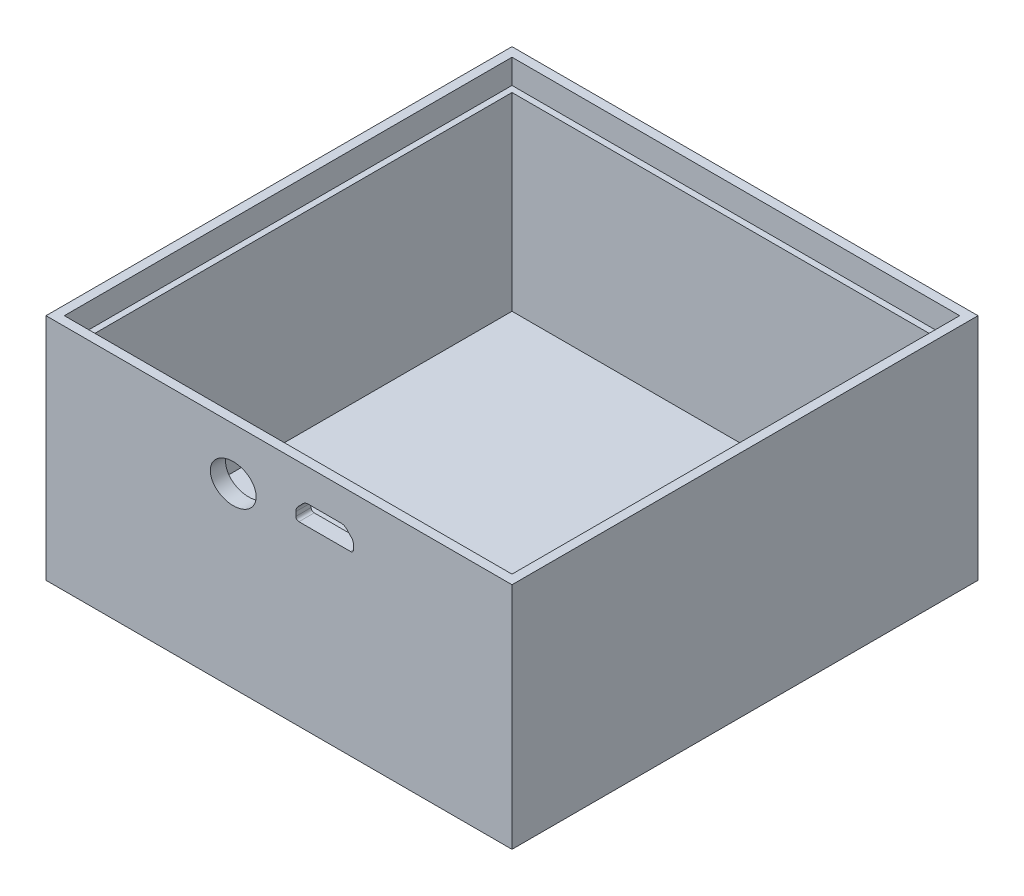
ISO-10303-21;
HEADER;
FILE_DESCRIPTION(('STEP AP214'),'2;1');
FILE_NAME('part.step','',(''),(''),'','','');
FILE_SCHEMA(('AUTOMOTIVE_DESIGN { 1 0 10303 214 1 1 1 1 }'));
ENDSEC;
DATA;
#1=APPLICATION_CONTEXT('core data for automotive mechanical design processes');
#2=APPLICATION_PROTOCOL_DEFINITION('international standard','automotive_design',2000,#1);
#3=PRODUCT_CONTEXT('',#1,'mechanical');
#4=PRODUCT('Part','Part','',(#3));
#5=PRODUCT_RELATED_PRODUCT_CATEGORY('part','',(#4));
#6=PRODUCT_DEFINITION_FORMATION('','',#4);
#7=PRODUCT_DEFINITION_CONTEXT('part definition',#1,'design');
#8=PRODUCT_DEFINITION('design','',#6,#7);
#9=PRODUCT_DEFINITION_SHAPE('','',#8);
#10=(LENGTH_UNIT() NAMED_UNIT(*) SI_UNIT(.MILLI.,.METRE.));
#11=(NAMED_UNIT(*) PLANE_ANGLE_UNIT() SI_UNIT($,.RADIAN.));
#12=(NAMED_UNIT(*) SI_UNIT($,.STERADIAN.) SOLID_ANGLE_UNIT());
#13=UNCERTAINTY_MEASURE_WITH_UNIT(LENGTH_MEASURE(1.E-05),#10,'distance_accuracy_value','');
#14=(GEOMETRIC_REPRESENTATION_CONTEXT(3) GLOBAL_UNCERTAINTY_ASSIGNED_CONTEXT((#13)) GLOBAL_UNIT_ASSIGNED_CONTEXT((#10,
#11,#12)) REPRESENTATION_CONTEXT('',''));
#15=CARTESIAN_POINT('',(0.,0.,0.));
#16=DIRECTION('',(0.,0.,1.));
#17=DIRECTION('',(1.,0.,0.));
#18=AXIS2_PLACEMENT_3D('',#15,#16,#17);
#19=CARTESIAN_POINT('',(-28.5,30.,0.));
#20=DIRECTION('',(0.,0.,-1.));
#21=DIRECTION('',(-1.,0.,0.));
#22=AXIS2_PLACEMENT_3D('',#19,#20,#21);
#23=PLANE('',#22);
#24=DIRECTION('',(-1.,0.,0.));
#25=VECTOR('',#24,1.);
#26=CARTESIAN_POINT('',(-28.5,2.,0.));
#27=LINE('',#26,#25);
#28=CARTESIAN_POINT('',(28.5,2.,0.));
#29=VERTEX_POINT('',#28);
#30=CARTESIAN_POINT('',(-28.5,2.,0.));
#31=VERTEX_POINT('',#30);
#32=EDGE_CURVE('E213',#29,#31,#27,.T.);
#33=ORIENTED_EDGE('',*,*,#32,.T.);
#34=DIRECTION('',(0.,-1.,0.));
#35=VECTOR('',#34,1.);
#36=CARTESIAN_POINT('',(-28.5,30.,0.));
#37=LINE('',#36,#35);
#38=CARTESIAN_POINT('',(-28.5,26.8,0.));
#39=VERTEX_POINT('',#38);
#40=EDGE_CURVE('E201',#39,#31,#37,.T.);
#41=ORIENTED_EDGE('',*,*,#40,.F.);
#42=DIRECTION('',(1.,0.,0.));
#43=VECTOR('',#42,1.);
#44=CARTESIAN_POINT('',(-28.5,26.8,0.));
#45=LINE('',#44,#43);
#46=CARTESIAN_POINT('',(28.5,26.8,0.));
#47=VERTEX_POINT('',#46);
#48=EDGE_CURVE('E210',#39,#47,#45,.T.);
#49=ORIENTED_EDGE('',*,*,#48,.T.);
#50=DIRECTION('',(0.,-1.,0.));
#51=VECTOR('',#50,1.);
#52=CARTESIAN_POINT('',(28.5,30.,0.));
#53=LINE('',#52,#51);
#54=EDGE_CURVE('E215',#47,#29,#53,.T.);
#55=ORIENTED_EDGE('',*,*,#54,.T.);
#56=EDGE_LOOP('',(#33,#41,#49,#55));
#57=FACE_BOUND('',#56,.T.);
#58=CARTESIAN_POINT('',(-5.99255578575196,23.2153393240226,0.));
#59=DIRECTION('',(0.,0.,-1.));
#60=DIRECTION('',(1.,0.,0.));
#61=AXIS2_PLACEMENT_3D('',#58,#59,#60);
#62=ELLIPSE('',#61,3.,2.5);
#63=CARTESIAN_POINT('',(-2.99255578575196,23.2153393240226,0.));
#64=VERTEX_POINT('',#63);
#65=EDGE_CURVE('E217',#64,#64,#62,.T.);
#66=ORIENTED_EDGE('',*,*,#65,.F.);
#67=EDGE_LOOP('',(#66));
#68=FACE_BOUND('',#67,.T.);
#69=CARTESIAN_POINT('',(2.60777454000149,23.6,0.));
#70=DIRECTION('',(0.,0.,-1.));
#71=DIRECTION('',(-1.,0.,0.));
#72=AXIS2_PLACEMENT_3D('',#69,#70,#71);
#73=CIRCLE('',#72,0.399999999999942);
#74=CARTESIAN_POINT('',(2.20777454000155,23.6,0.));
#75=VERTEX_POINT('',#74);
#76=CARTESIAN_POINT('',(2.60777454000149,23.2,0.));
#77=VERTEX_POINT('',#76);
#78=EDGE_CURVE('E256',#75,#77,#73,.F.);
#79=ORIENTED_EDGE('',*,*,#78,.T.);
#80=DIRECTION('',(1.,0.,0.));
#81=VECTOR('',#80,1.);
#82=CARTESIAN_POINT('',(0.,23.2000000000001,0.));
#83=LINE('',#82,#81);
#84=CARTESIAN_POINT('',(9.35777454000155,23.2,0.));
#85=VERTEX_POINT('',#84);
#86=EDGE_CURVE('E253',#77,#85,#83,.T.);
#87=ORIENTED_EDGE('',*,*,#86,.T.);
#88=CARTESIAN_POINT('',(9.35777454000155,23.6,0.));
#89=DIRECTION('',(0.,0.,-1.));
#90=DIRECTION('',(-1.,0.,0.));
#91=AXIS2_PLACEMENT_3D('',#88,#89,#90);
#92=CIRCLE('',#91,0.39999999999994);
#93=CARTESIAN_POINT('',(9.75777454000149,23.6,0.));
#94=VERTEX_POINT('',#93);
#95=EDGE_CURVE('E227',#85,#94,#92,.F.);
#96=ORIENTED_EDGE('',*,*,#95,.T.);
#97=DIRECTION('',(0.,1.,0.));
#98=VECTOR('',#97,1.);
#99=CARTESIAN_POINT('',(9.75777454000142,0.,0.));
#100=LINE('',#99,#98);
#101=CARTESIAN_POINT('',(9.75777454000149,24.147689712403,0.));
#102=VERTEX_POINT('',#101);
#103=EDGE_CURVE('E284',#94,#102,#100,.T.);
#104=ORIENTED_EDGE('',*,*,#103,.T.);
#105=CARTESIAN_POINT('',(8.75777454000148,24.147689712403,0.));
#106=DIRECTION('',(0.,0.,-1.));
#107=DIRECTION('',(-1.,0.,0.));
#108=AXIS2_PLACEMENT_3D('',#105,#106,#107);
#109=CIRCLE('',#108,1.00000000000001);
#110=CARTESIAN_POINT('',(9.47916186103244,24.8402215405928,0.));
#111=VERTEX_POINT('',#110);
#112=EDGE_CURVE('E281',#102,#111,#109,.F.);
#113=ORIENTED_EDGE('',*,*,#112,.T.);
#114=DIRECTION('',(-0.692531828189709,0.721387321030956,0.));
#115=VECTOR('',#114,1.);
#116=CARTESIAN_POINT('',(17.3427219712748,16.6490130924236,0.));
#117=LINE('',#116,#115);
#118=CARTESIAN_POINT('',(8.85294398493937,25.4925318281897,0.));
#119=VERTEX_POINT('',#118);
#120=EDGE_CURVE('E278',#111,#119,#117,.T.);
#121=ORIENTED_EDGE('',*,*,#120,.T.);
#122=CARTESIAN_POINT('',(8.13155666390841,24.8,0.));
#123=DIRECTION('',(0.,0.,-1.));
#124=DIRECTION('',(-1.,0.,0.));
#125=AXIS2_PLACEMENT_3D('',#122,#123,#124);
#126=CIRCLE('',#125,1.00000000000001);
#127=CARTESIAN_POINT('',(8.13155666390841,25.8,0.));
#128=VERTEX_POINT('',#127);
#129=EDGE_CURVE('E275',#119,#128,#126,.F.);
#130=ORIENTED_EDGE('',*,*,#129,.T.);
#131=DIRECTION('',(-1.,0.,0.));
#132=VECTOR('',#131,1.);
#133=CARTESIAN_POINT('',(0.,25.8,0.));
#134=LINE('',#133,#132);
#135=CARTESIAN_POINT('',(3.83399241609457,25.8,0.));
#136=VERTEX_POINT('',#135);
#137=EDGE_CURVE('E272',#128,#136,#134,.T.);
#138=ORIENTED_EDGE('',*,*,#137,.T.);
#139=CARTESIAN_POINT('',(3.83399241609457,24.8,0.));
#140=DIRECTION('',(0.,0.,-1.));
#141=DIRECTION('',(-1.,0.,0.));
#142=AXIS2_PLACEMENT_3D('',#139,#140,#141);
#143=CIRCLE('',#142,1.00000000000002);
#144=CARTESIAN_POINT('',(3.11260509506368,25.4925318281898,0.));
#145=VERTEX_POINT('',#144);
#146=EDGE_CURVE('E269',#145,#136,#143,.T.);
#147=ORIENTED_EDGE('',*,*,#146,.F.);
#148=DIRECTION('',(0.692531828189797,0.721387321030872,0.));
#149=VECTOR('',#148,1.);
#150=CARTESIAN_POINT('',(-11.115854215237,10.67122004663,0.));
#151=LINE('',#150,#149);
#152=CARTESIAN_POINT('',(2.48638721897064,24.840221540593,0.));
#153=VERTEX_POINT('',#152);
#154=EDGE_CURVE('E266',#153,#145,#151,.T.);
#155=ORIENTED_EDGE('',*,*,#154,.F.);
#156=CARTESIAN_POINT('',(3.20777454000152,24.1476897124032,0.));
#157=DIRECTION('',(0.,0.,-1.));
#158=DIRECTION('',(-1.,0.,0.));
#159=AXIS2_PLACEMENT_3D('',#156,#157,#158);
#160=CIRCLE('',#159,1.00000000000001);
#161=CARTESIAN_POINT('',(2.20777454000151,24.1476897124032,0.));
#162=VERTEX_POINT('',#161);
#163=EDGE_CURVE('E263',#153,#162,#160,.F.);
#164=ORIENTED_EDGE('',*,*,#163,.T.);
#165=DIRECTION('',(0.,1.,0.));
#166=VECTOR('',#165,1.);
#167=CARTESIAN_POINT('',(2.2077745400033,1.64330529824927E-13,0.));
#168=LINE('',#167,#166);
#169=EDGE_CURVE('E260',#75,#162,#168,.T.);
#170=ORIENTED_EDGE('',*,*,#169,.F.);
#171=EDGE_LOOP('',(#79,#87,#96,#104,#113,#121,#130,#138,#147,#155,#164,#170));
#172=FACE_BOUND('',#171,.T.);
#173=ADVANCED_FACE('F38',(#57,#68,#172),#23,.T.);
#174=CARTESIAN_POINT('',(30.5,30.,2.));
#175=DIRECTION('',(0.,0.,-1.));
#176=DIRECTION('',(-1.,0.,0.));
#177=AXIS2_PLACEMENT_3D('',#174,#175,#176);
#178=PLANE('',#177);
#179=DIRECTION('',(1.,0.,0.));
#180=VECTOR('',#179,1.);
#181=CARTESIAN_POINT('',(30.5,0.,2.));
#182=LINE('',#181,#180);
#183=CARTESIAN_POINT('',(-30.5,0.,2.00000000000001));
#184=VERTEX_POINT('',#183);
#185=CARTESIAN_POINT('',(30.5,0.,2.));
#186=VERTEX_POINT('',#185);
#187=EDGE_CURVE('E398',#184,#186,#182,.T.);
#188=ORIENTED_EDGE('',*,*,#187,.T.);
#189=DIRECTION('',(0.,-1.,0.));
#190=VECTOR('',#189,1.);
#191=CARTESIAN_POINT('',(30.5,30.,2.));
#192=LINE('',#191,#190);
#193=CARTESIAN_POINT('',(30.5,30.,2.));
#194=VERTEX_POINT('',#193);
#195=EDGE_CURVE('E404',#194,#186,#192,.T.);
#196=ORIENTED_EDGE('',*,*,#195,.F.);
#197=DIRECTION('',(1.,0.,0.));
#198=VECTOR('',#197,1.);
#199=CARTESIAN_POINT('',(30.5,30.,2.));
#200=LINE('',#199,#198);
#201=CARTESIAN_POINT('',(-30.5,30.,2.00000000000001));
#202=VERTEX_POINT('',#201);
#203=EDGE_CURVE('E407',#202,#194,#200,.T.);
#204=ORIENTED_EDGE('',*,*,#203,.F.);
#205=DIRECTION('',(0.,-1.,0.));
#206=VECTOR('',#205,1.);
#207=CARTESIAN_POINT('',(-30.5,30.,2.00000000000001));
#208=LINE('',#207,#206);
#209=EDGE_CURVE('E395',#202,#184,#208,.T.);
#210=ORIENTED_EDGE('',*,*,#209,.T.);
#211=EDGE_LOOP('',(#188,#196,#204,#210));
#212=FACE_BOUND('',#211,.T.);
#213=CARTESIAN_POINT('',(-5.99255578575196,23.2153393240226,2.00000000000001));
#214=DIRECTION('',(0.,0.,-1.));
#215=DIRECTION('',(1.,0.,0.));
#216=AXIS2_PLACEMENT_3D('',#213,#214,#215);
#217=ELLIPSE('',#216,3.,2.5);
#218=CARTESIAN_POINT('',(-2.99255578575196,23.2153393240226,2.00000000000001));
#219=VERTEX_POINT('',#218);
#220=EDGE_CURVE('E257',#219,#219,#217,.T.);
#221=ORIENTED_EDGE('',*,*,#220,.T.);
#222=EDGE_LOOP('',(#221));
#223=FACE_BOUND('',#222,.T.);
#224=DIRECTION('',(1.,0.,0.));
#225=VECTOR('',#224,1.);
#226=CARTESIAN_POINT('',(0.,23.2000000000001,2.00000000000001));
#227=LINE('',#226,#225);
#228=CARTESIAN_POINT('',(2.60777454000149,23.2,2.00000000000001));
#229=VERTEX_POINT('',#228);
#230=CARTESIAN_POINT('',(9.35777454000155,23.2,2.00000000000001));
#231=VERTEX_POINT('',#230);
#232=EDGE_CURVE('E224',#229,#231,#227,.T.);
#233=ORIENTED_EDGE('',*,*,#232,.F.);
#234=CARTESIAN_POINT('',(2.60777454000149,23.6,2.00000000000001));
#235=DIRECTION('',(0.,0.,-1.));
#236=DIRECTION('',(-1.,0.,0.));
#237=AXIS2_PLACEMENT_3D('',#234,#235,#236);
#238=CIRCLE('',#237,0.399999999999942);
#239=CARTESIAN_POINT('',(2.20777454000155,23.6,2.00000000000001));
#240=VERTEX_POINT('',#239);
#241=EDGE_CURVE('E226',#240,#229,#238,.F.);
#242=ORIENTED_EDGE('',*,*,#241,.F.);
#243=DIRECTION('',(0.,1.,0.));
#244=VECTOR('',#243,1.);
#245=CARTESIAN_POINT('',(2.2077745400033,1.64330529824927E-13,2.00000000000001));
#246=LINE('',#245,#244);
#247=CARTESIAN_POINT('',(2.20777454000151,24.1476897124032,2.00000000000001));
#248=VERTEX_POINT('',#247);
#249=EDGE_CURVE('E229',#240,#248,#246,.T.);
#250=ORIENTED_EDGE('',*,*,#249,.T.);
#251=CARTESIAN_POINT('',(3.20777454000152,24.1476897124032,2.00000000000001));
#252=DIRECTION('',(0.,0.,-1.));
#253=DIRECTION('',(-1.,0.,0.));
#254=AXIS2_PLACEMENT_3D('',#251,#252,#253);
#255=CIRCLE('',#254,1.00000000000001);
#256=CARTESIAN_POINT('',(2.48638721897064,24.840221540593,2.00000000000001));
#257=VERTEX_POINT('',#256);
#258=EDGE_CURVE('E232',#257,#248,#255,.F.);
#259=ORIENTED_EDGE('',*,*,#258,.F.);
#260=DIRECTION('',(0.692531828189797,0.721387321030872,0.));
#261=VECTOR('',#260,1.);
#262=CARTESIAN_POINT('',(-11.115854215237,10.67122004663,2.00000000000001));
#263=LINE('',#262,#261);
#264=CARTESIAN_POINT('',(3.11260509506368,25.4925318281898,2.00000000000001));
#265=VERTEX_POINT('',#264);
#266=EDGE_CURVE('E234',#257,#265,#263,.T.);
#267=ORIENTED_EDGE('',*,*,#266,.T.);
#268=CARTESIAN_POINT('',(3.83399241609457,24.8,2.00000000000001));
#269=DIRECTION('',(0.,0.,-1.));
#270=DIRECTION('',(-1.,0.,0.));
#271=AXIS2_PLACEMENT_3D('',#268,#269,#270);
#272=CIRCLE('',#271,1.00000000000002);
#273=CARTESIAN_POINT('',(3.83399241609457,25.8,2.00000000000001));
#274=VERTEX_POINT('',#273);
#275=EDGE_CURVE('E237',#265,#274,#272,.T.);
#276=ORIENTED_EDGE('',*,*,#275,.T.);
#277=DIRECTION('',(-1.,0.,0.));
#278=VECTOR('',#277,1.);
#279=CARTESIAN_POINT('',(0.,25.8,2.00000000000001));
#280=LINE('',#279,#278);
#281=CARTESIAN_POINT('',(8.13155666390841,25.8,2.00000000000001));
#282=VERTEX_POINT('',#281);
#283=EDGE_CURVE('E240',#282,#274,#280,.T.);
#284=ORIENTED_EDGE('',*,*,#283,.F.);
#285=CARTESIAN_POINT('',(8.13155666390841,24.8,2.00000000000001));
#286=DIRECTION('',(0.,0.,-1.));
#287=DIRECTION('',(-1.,0.,0.));
#288=AXIS2_PLACEMENT_3D('',#285,#286,#287);
#289=CIRCLE('',#288,1.00000000000001);
#290=CARTESIAN_POINT('',(8.85294398493937,25.4925318281897,2.00000000000001));
#291=VERTEX_POINT('',#290);
#292=EDGE_CURVE('E242',#291,#282,#289,.F.);
#293=ORIENTED_EDGE('',*,*,#292,.F.);
#294=DIRECTION('',(-0.692531828189709,0.721387321030956,0.));
#295=VECTOR('',#294,1.);
#296=CARTESIAN_POINT('',(17.3427219712748,16.6490130924236,2.00000000000001));
#297=LINE('',#296,#295);
#298=CARTESIAN_POINT('',(9.47916186103244,24.8402215405928,2.00000000000001));
#299=VERTEX_POINT('',#298);
#300=EDGE_CURVE('E244',#299,#291,#297,.T.);
#301=ORIENTED_EDGE('',*,*,#300,.F.);
#302=CARTESIAN_POINT('',(8.75777454000148,24.147689712403,2.00000000000001));
#303=DIRECTION('',(0.,0.,-1.));
#304=DIRECTION('',(-1.,0.,0.));
#305=AXIS2_PLACEMENT_3D('',#302,#303,#304);
#306=CIRCLE('',#305,1.00000000000001);
#307=CARTESIAN_POINT('',(9.75777454000149,24.147689712403,2.00000000000001));
#308=VERTEX_POINT('',#307);
#309=EDGE_CURVE('E246',#308,#299,#306,.F.);
#310=ORIENTED_EDGE('',*,*,#309,.F.);
#311=DIRECTION('',(0.,1.,0.));
#312=VECTOR('',#311,1.);
#313=CARTESIAN_POINT('',(9.75777454000142,0.,2.00000000000001));
#314=LINE('',#313,#312);
#315=CARTESIAN_POINT('',(9.75777454000149,23.6,2.00000000000001));
#316=VERTEX_POINT('',#315);
#317=EDGE_CURVE('E248',#316,#308,#314,.T.);
#318=ORIENTED_EDGE('',*,*,#317,.F.);
#319=CARTESIAN_POINT('',(9.35777454000155,23.6,2.00000000000001));
#320=DIRECTION('',(0.,0.,-1.));
#321=DIRECTION('',(-1.,0.,0.));
#322=AXIS2_PLACEMENT_3D('',#319,#320,#321);
#323=CIRCLE('',#322,0.39999999999994);
#324=EDGE_CURVE('E250',#231,#316,#323,.F.);
#325=ORIENTED_EDGE('',*,*,#324,.F.);
#326=EDGE_LOOP('',(#233,#242,#250,#259,#267,#276,#284,#293,#301,#310,#318,#325));
#327=FACE_BOUND('',#326,.T.);
#328=ADVANCED_FACE('F357',(#212,#223,#327),#178,.F.);
#329=CARTESIAN_POINT('',(28.5,30.,0.));
#330=DIRECTION('',(-1.,0.,0.));
#331=DIRECTION('',(0.,0.,1.));
#332=AXIS2_PLACEMENT_3D('',#329,#330,#331);
#333=PLANE('',#332);
#334=DIRECTION('',(0.,0.,1.));
#335=VECTOR('',#334,1.);
#336=CARTESIAN_POINT('',(28.5,2.,0.));
#337=LINE('',#336,#335);
#338=CARTESIAN_POINT('',(28.5,2.,-57.));
#339=VERTEX_POINT('',#338);
#340=EDGE_CURVE('E53',#339,#29,#337,.T.);
#341=ORIENTED_EDGE('',*,*,#340,.T.);
#342=ORIENTED_EDGE('',*,*,#54,.F.);
#343=DIRECTION('',(0.,0.,-1.));
#344=VECTOR('',#343,1.);
#345=CARTESIAN_POINT('',(28.5,26.8,0.));
#346=LINE('',#345,#344);
#347=CARTESIAN_POINT('',(28.5,26.8,-57.));
#348=VERTEX_POINT('',#347);
#349=EDGE_CURVE('E425',#47,#348,#346,.T.);
#350=ORIENTED_EDGE('',*,*,#349,.T.);
#351=DIRECTION('',(0.,-1.,0.));
#352=VECTOR('',#351,1.);
#353=CARTESIAN_POINT('',(28.5,30.,-57.));
#354=LINE('',#353,#352);
#355=EDGE_CURVE('E418',#348,#339,#354,.T.);
#356=ORIENTED_EDGE('',*,*,#355,.T.);
#357=EDGE_LOOP('',(#341,#342,#350,#356));
#358=FACE_BOUND('',#357,.T.);
#359=ADVANCED_FACE('F354',(#358),#333,.T.);
#360=CARTESIAN_POINT('',(28.5,30.,-57.));
#361=DIRECTION('',(0.,0.,1.));
#362=DIRECTION('',(1.,0.,0.));
#363=AXIS2_PLACEMENT_3D('',#360,#361,#362);
#364=PLANE('',#363);
#365=DIRECTION('',(1.,0.,0.));
#366=VECTOR('',#365,1.);
#367=CARTESIAN_POINT('',(28.5,2.,-57.));
#368=LINE('',#367,#366);
#369=CARTESIAN_POINT('',(-28.5,2.,-57.));
#370=VERTEX_POINT('',#369);
#371=EDGE_CURVE('E61',#370,#339,#368,.T.);
#372=ORIENTED_EDGE('',*,*,#371,.T.);
#373=ORIENTED_EDGE('',*,*,#355,.F.);
#374=DIRECTION('',(-1.,0.,0.));
#375=VECTOR('',#374,1.);
#376=CARTESIAN_POINT('',(28.5,26.8,-57.));
#377=LINE('',#376,#375);
#378=CARTESIAN_POINT('',(-28.5,26.8,-57.));
#379=VERTEX_POINT('',#378);
#380=EDGE_CURVE('E428',#348,#379,#377,.T.);
#381=ORIENTED_EDGE('',*,*,#380,.T.);
#382=DIRECTION('',(0.,-1.,0.));
#383=VECTOR('',#382,1.);
#384=CARTESIAN_POINT('',(-28.5,30.,-57.));
#385=LINE('',#384,#383);
#386=EDGE_CURVE('E209',#379,#370,#385,.T.);
#387=ORIENTED_EDGE('',*,*,#386,.T.);
#388=EDGE_LOOP('',(#372,#373,#381,#387));
#389=FACE_BOUND('',#388,.T.);
#390=ADVANCED_FACE('F351',(#389),#364,.T.);
#391=CARTESIAN_POINT('',(-28.5,30.,-57.));
#392=DIRECTION('',(1.,0.,0.));
#393=DIRECTION('',(0.,0.,-1.));
#394=AXIS2_PLACEMENT_3D('',#391,#392,#393);
#395=PLANE('',#394);
#396=DIRECTION('',(0.,0.,-1.));
#397=VECTOR('',#396,1.);
#398=CARTESIAN_POINT('',(-28.5,2.,-57.));
#399=LINE('',#398,#397);
#400=EDGE_CURVE('E206',#31,#370,#399,.T.);
#401=ORIENTED_EDGE('',*,*,#400,.T.);
#402=ORIENTED_EDGE('',*,*,#386,.F.);
#403=DIRECTION('',(0.,0.,1.));
#404=VECTOR('',#403,1.);
#405=CARTESIAN_POINT('',(-28.5,26.8,-57.));
#406=LINE('',#405,#404);
#407=EDGE_CURVE('E11',#379,#39,#406,.T.);
#408=ORIENTED_EDGE('',*,*,#407,.T.);
#409=ORIENTED_EDGE('',*,*,#40,.T.);
#410=EDGE_LOOP('',(#401,#402,#408,#409));
#411=FACE_BOUND('',#410,.T.);
#412=ADVANCED_FACE('F203',(#411),#395,.T.);
#413=CARTESIAN_POINT('',(0.,30.,0.));
#414=DIRECTION('',(0.,-1.,0.));
#415=DIRECTION('',(0.,0.,-1.));
#416=AXIS2_PLACEMENT_3D('',#413,#414,#415);
#417=PLANE('',#416);
#418=DIRECTION('',(0.,0.,1.));
#419=VECTOR('',#418,1.);
#420=CARTESIAN_POINT('',(-29.3,30.,-57.8));
#421=LINE('',#420,#419);
#422=CARTESIAN_POINT('',(-29.3,30.,-57.8));
#423=VERTEX_POINT('',#422);
#424=CARTESIAN_POINT('',(-29.3,30.,0.8));
#425=VERTEX_POINT('',#424);
#426=EDGE_CURVE('E448',#423,#425,#421,.T.);
#427=ORIENTED_EDGE('',*,*,#426,.F.);
#428=DIRECTION('',(-1.,0.,0.));
#429=VECTOR('',#428,1.);
#430=CARTESIAN_POINT('',(29.3,30.,-57.8));
#431=LINE('',#430,#429);
#432=CARTESIAN_POINT('',(29.3,30.,-57.8));
#433=VERTEX_POINT('',#432);
#434=EDGE_CURVE('E292',#433,#423,#431,.T.);
#435=ORIENTED_EDGE('',*,*,#434,.F.);
#436=DIRECTION('',(0.,0.,-1.));
#437=VECTOR('',#436,1.);
#438=CARTESIAN_POINT('',(29.3,30.,0.8));
#439=LINE('',#438,#437);
#440=CARTESIAN_POINT('',(29.3,30.,0.8));
#441=VERTEX_POINT('',#440);
#442=EDGE_CURVE('E441',#441,#433,#439,.T.);
#443=ORIENTED_EDGE('',*,*,#442,.F.);
#444=DIRECTION('',(1.,0.,0.));
#445=VECTOR('',#444,1.);
#446=CARTESIAN_POINT('',(-29.3,30.,0.8));
#447=LINE('',#446,#445);
#448=EDGE_CURVE('E445',#425,#441,#447,.T.);
#449=ORIENTED_EDGE('',*,*,#448,.F.);
#450=EDGE_LOOP('',(#427,#435,#443,#449));
#451=FACE_BOUND('',#450,.T.);
#452=DIRECTION('',(0.,0.,-1.));
#453=VECTOR('',#452,1.);
#454=CARTESIAN_POINT('',(30.5,30.,-59.));
#455=LINE('',#454,#453);
#456=CARTESIAN_POINT('',(30.5,30.,-59.));
#457=VERTEX_POINT('',#456);
#458=EDGE_CURVE('E400',#194,#457,#455,.T.);
#459=ORIENTED_EDGE('',*,*,#458,.T.);
#460=DIRECTION('',(-1.,0.,0.));
#461=VECTOR('',#460,1.);
#462=CARTESIAN_POINT('',(-30.5,30.,-59.));
#463=LINE('',#462,#461);
#464=CARTESIAN_POINT('',(-30.5,30.,-59.));
#465=VERTEX_POINT('',#464);
#466=EDGE_CURVE('E415',#457,#465,#463,.T.);
#467=ORIENTED_EDGE('',*,*,#466,.T.);
#468=DIRECTION('',(0.,0.,1.));
#469=VECTOR('',#468,1.);
#470=CARTESIAN_POINT('',(-30.5,30.,2.00000000000001));
#471=LINE('',#470,#469);
#472=EDGE_CURVE('E394',#465,#202,#471,.T.);
#473=ORIENTED_EDGE('',*,*,#472,.T.);
#474=ORIENTED_EDGE('',*,*,#203,.T.);
#475=EDGE_LOOP('',(#459,#467,#473,#474));
#476=FACE_BOUND('',#475,.T.);
#477=ADVANCED_FACE('F350',(#451,#476),#417,.F.);
#478=CARTESIAN_POINT('',(0.,0.,0.));
#479=DIRECTION('',(0.,-1.,0.));
#480=DIRECTION('',(0.,0.,-1.));
#481=AXIS2_PLACEMENT_3D('',#478,#479,#480);
#482=PLANE('',#481);
#483=DIRECTION('',(0.,0.,-1.));
#484=VECTOR('',#483,1.);
#485=CARTESIAN_POINT('',(30.5,0.,-59.));
#486=LINE('',#485,#484);
#487=CARTESIAN_POINT('',(30.5,0.,-59.));
#488=VERTEX_POINT('',#487);
#489=EDGE_CURVE('E390',#186,#488,#486,.T.);
#490=ORIENTED_EDGE('',*,*,#489,.F.);
#491=ORIENTED_EDGE('',*,*,#187,.F.);
#492=DIRECTION('',(0.,0.,1.));
#493=VECTOR('',#492,1.);
#494=CARTESIAN_POINT('',(-30.5,0.,2.00000000000001));
#495=LINE('',#494,#493);
#496=CARTESIAN_POINT('',(-30.5,0.,-59.));
#497=VERTEX_POINT('',#496);
#498=EDGE_CURVE('E389',#497,#184,#495,.T.);
#499=ORIENTED_EDGE('',*,*,#498,.F.);
#500=DIRECTION('',(-1.,0.,0.));
#501=VECTOR('',#500,1.);
#502=CARTESIAN_POINT('',(-30.5,0.,-59.));
#503=LINE('',#502,#501);
#504=EDGE_CURVE('E381',#488,#497,#503,.T.);
#505=ORIENTED_EDGE('',*,*,#504,.F.);
#506=EDGE_LOOP('',(#490,#491,#499,#505));
#507=FACE_BOUND('',#506,.T.);
#508=ADVANCED_FACE('F362',(#507),#482,.T.);
#509=CARTESIAN_POINT('',(30.5,30.,-59.));
#510=DIRECTION('',(-1.,0.,0.));
#511=DIRECTION('',(0.,0.,1.));
#512=AXIS2_PLACEMENT_3D('',#509,#510,#511);
#513=PLANE('',#512);
#514=ORIENTED_EDGE('',*,*,#489,.T.);
#515=DIRECTION('',(0.,-1.,0.));
#516=VECTOR('',#515,1.);
#517=CARTESIAN_POINT('',(30.5,30.,-59.));
#518=LINE('',#517,#516);
#519=EDGE_CURVE('E46',#457,#488,#518,.T.);
#520=ORIENTED_EDGE('',*,*,#519,.F.);
#521=ORIENTED_EDGE('',*,*,#458,.F.);
#522=ORIENTED_EDGE('',*,*,#195,.T.);
#523=EDGE_LOOP('',(#514,#520,#521,#522));
#524=FACE_BOUND('',#523,.T.);
#525=ADVANCED_FACE('F40',(#524),#513,.F.);
#526=CARTESIAN_POINT('',(-30.5,30.,-59.));
#527=DIRECTION('',(0.,0.,1.));
#528=DIRECTION('',(1.,0.,0.));
#529=AXIS2_PLACEMENT_3D('',#526,#527,#528);
#530=PLANE('',#529);
#531=ORIENTED_EDGE('',*,*,#504,.T.);
#532=DIRECTION('',(0.,-1.,0.));
#533=VECTOR('',#532,1.);
#534=CARTESIAN_POINT('',(-30.5,30.,-59.));
#535=LINE('',#534,#533);
#536=EDGE_CURVE('E383',#465,#497,#535,.T.);
#537=ORIENTED_EDGE('',*,*,#536,.F.);
#538=ORIENTED_EDGE('',*,*,#466,.F.);
#539=ORIENTED_EDGE('',*,*,#519,.T.);
#540=EDGE_LOOP('',(#531,#537,#538,#539));
#541=FACE_BOUND('',#540,.T.);
#542=ADVANCED_FACE('F371',(#541),#530,.F.);
#543=CARTESIAN_POINT('',(-30.5,30.,2.00000000000001));
#544=DIRECTION('',(1.,0.,0.));
#545=DIRECTION('',(0.,0.,-1.));
#546=AXIS2_PLACEMENT_3D('',#543,#544,#545);
#547=PLANE('',#546);
#548=ORIENTED_EDGE('',*,*,#498,.T.);
#549=ORIENTED_EDGE('',*,*,#209,.F.);
#550=ORIENTED_EDGE('',*,*,#472,.F.);
#551=ORIENTED_EDGE('',*,*,#536,.T.);
#552=EDGE_LOOP('',(#548,#549,#550,#551));
#553=FACE_BOUND('',#552,.T.);
#554=ADVANCED_FACE('F346',(#553),#547,.F.);
#555=CARTESIAN_POINT('',(29.3,26.8,-57.8));
#556=DIRECTION('',(0.,0.,-1.));
#557=DIRECTION('',(-1.,0.,0.));
#558=AXIS2_PLACEMENT_3D('',#555,#556,#557);
#559=PLANE('',#558);
#560=ORIENTED_EDGE('',*,*,#434,.T.);
#561=DIRECTION('',(0.,1.,0.));
#562=VECTOR('',#561,1.);
#563=CARTESIAN_POINT('',(-29.3,26.8,-57.8));
#564=LINE('',#563,#562);
#565=CARTESIAN_POINT('',(-29.3,26.8,-57.8));
#566=VERTEX_POINT('',#565);
#567=EDGE_CURVE('E432',#566,#423,#564,.T.);
#568=ORIENTED_EDGE('',*,*,#567,.F.);
#569=DIRECTION('',(-1.,0.,0.));
#570=VECTOR('',#569,1.);
#571=CARTESIAN_POINT('',(29.3,26.8,-57.8));
#572=LINE('',#571,#570);
#573=CARTESIAN_POINT('',(29.3,26.8,-57.8));
#574=VERTEX_POINT('',#573);
#575=EDGE_CURVE('E444',#574,#566,#572,.T.);
#576=ORIENTED_EDGE('',*,*,#575,.F.);
#577=DIRECTION('',(0.,1.,0.));
#578=VECTOR('',#577,1.);
#579=CARTESIAN_POINT('',(29.3,26.8,-57.8));
#580=LINE('',#579,#578);
#581=EDGE_CURVE('E431',#574,#433,#580,.T.);
#582=ORIENTED_EDGE('',*,*,#581,.T.);
#583=EDGE_LOOP('',(#560,#568,#576,#582));
#584=FACE_BOUND('',#583,.T.);
#585=ADVANCED_FACE('F336',(#584),#559,.F.);
#586=CARTESIAN_POINT('',(29.3,26.8,0.8));
#587=DIRECTION('',(1.,0.,0.));
#588=DIRECTION('',(0.,0.,-1.));
#589=AXIS2_PLACEMENT_3D('',#586,#587,#588);
#590=PLANE('',#589);
#591=ORIENTED_EDGE('',*,*,#442,.T.);
#592=ORIENTED_EDGE('',*,*,#581,.F.);
#593=DIRECTION('',(0.,0.,-1.));
#594=VECTOR('',#593,1.);
#595=CARTESIAN_POINT('',(29.3,26.8,0.8));
#596=LINE('',#595,#594);
#597=CARTESIAN_POINT('',(29.3,26.8,0.8));
#598=VERTEX_POINT('',#597);
#599=EDGE_CURVE('E436',#598,#574,#596,.T.);
#600=ORIENTED_EDGE('',*,*,#599,.F.);
#601=DIRECTION('',(0.,1.,0.));
#602=VECTOR('',#601,1.);
#603=CARTESIAN_POINT('',(29.3,26.8,0.8));
#604=LINE('',#603,#602);
#605=EDGE_CURVE('E438',#598,#441,#604,.T.);
#606=ORIENTED_EDGE('',*,*,#605,.T.);
#607=EDGE_LOOP('',(#591,#592,#600,#606));
#608=FACE_BOUND('',#607,.T.);
#609=ADVANCED_FACE('F332',(#608),#590,.F.);
#610=CARTESIAN_POINT('',(-29.3,26.8,0.8));
#611=DIRECTION('',(0.,0.,1.));
#612=DIRECTION('',(1.,0.,0.));
#613=AXIS2_PLACEMENT_3D('',#610,#611,#612);
#614=PLANE('',#613);
#615=ORIENTED_EDGE('',*,*,#448,.T.);
#616=ORIENTED_EDGE('',*,*,#605,.F.);
#617=DIRECTION('',(1.,0.,0.));
#618=VECTOR('',#617,1.);
#619=CARTESIAN_POINT('',(-29.3,26.8,0.8));
#620=LINE('',#619,#618);
#621=CARTESIAN_POINT('',(-29.3,26.8,0.8));
#622=VERTEX_POINT('',#621);
#623=EDGE_CURVE('E454',#622,#598,#620,.T.);
#624=ORIENTED_EDGE('',*,*,#623,.F.);
#625=DIRECTION('',(0.,1.,0.));
#626=VECTOR('',#625,1.);
#627=CARTESIAN_POINT('',(-29.3,26.8,0.8));
#628=LINE('',#627,#626);
#629=EDGE_CURVE('E435',#622,#425,#628,.T.);
#630=ORIENTED_EDGE('',*,*,#629,.T.);
#631=EDGE_LOOP('',(#615,#616,#624,#630));
#632=FACE_BOUND('',#631,.T.);
#633=ADVANCED_FACE('F335',(#632),#614,.F.);
#634=CARTESIAN_POINT('',(-29.3,26.8,-57.8));
#635=DIRECTION('',(-1.,0.,0.));
#636=DIRECTION('',(0.,0.,1.));
#637=AXIS2_PLACEMENT_3D('',#634,#635,#636);
#638=PLANE('',#637);
#639=ORIENTED_EDGE('',*,*,#426,.T.);
#640=ORIENTED_EDGE('',*,*,#629,.F.);
#641=DIRECTION('',(0.,0.,1.));
#642=VECTOR('',#641,1.);
#643=CARTESIAN_POINT('',(-29.3,26.8,-57.8));
#644=LINE('',#643,#642);
#645=EDGE_CURVE('E457',#566,#622,#644,.T.);
#646=ORIENTED_EDGE('',*,*,#645,.F.);
#647=ORIENTED_EDGE('',*,*,#567,.T.);
#648=EDGE_LOOP('',(#639,#640,#646,#647));
#649=FACE_BOUND('',#648,.T.);
#650=ADVANCED_FACE('F330',(#649),#638,.F.);
#651=CARTESIAN_POINT('',(0.,26.8,0.));
#652=DIRECTION('',(0.,1.,0.));
#653=DIRECTION('',(0.,0.,1.));
#654=AXIS2_PLACEMENT_3D('',#651,#652,#653);
#655=PLANE('',#654);
#656=ORIENTED_EDGE('',*,*,#407,.F.);
#657=ORIENTED_EDGE('',*,*,#380,.F.);
#658=ORIENTED_EDGE('',*,*,#349,.F.);
#659=ORIENTED_EDGE('',*,*,#48,.F.);
#660=EDGE_LOOP('',(#656,#657,#658,#659));
#661=FACE_BOUND('',#660,.T.);
#662=ORIENTED_EDGE('',*,*,#575,.T.);
#663=ORIENTED_EDGE('',*,*,#645,.T.);
#664=ORIENTED_EDGE('',*,*,#623,.T.);
#665=ORIENTED_EDGE('',*,*,#599,.T.);
#666=EDGE_LOOP('',(#662,#663,#664,#665));
#667=FACE_BOUND('',#666,.T.);
#668=ADVANCED_FACE('F325',(#661,#667),#655,.T.);
#669=DIRECTION('',(0.,0.,-1.));
#670=VECTOR('',#669,1.);
#671=SURFACE_OF_LINEAR_EXTRUSION('',#217,#670);
#672=ORIENTED_EDGE('',*,*,#220,.F.);
#673=EDGE_LOOP('',(#672));
#674=FACE_BOUND('',#673,.T.);
#675=ORIENTED_EDGE('',*,*,#65,.T.);
#676=EDGE_LOOP('',(#675));
#677=FACE_BOUND('',#676,.T.);
#678=ADVANCED_FACE('F320',(#674,#677),#671,.F.);
#679=CARTESIAN_POINT('',(0.,23.2000000000001,2.00000000000001));
#680=DIRECTION('',(0.,1.,0.));
#681=DIRECTION('',(-1.,0.,0.));
#682=AXIS2_PLACEMENT_3D('',#679,#680,#681);
#683=PLANE('',#682);
#684=ORIENTED_EDGE('',*,*,#86,.F.);
#685=DIRECTION('',(0.,0.,-1.));
#686=VECTOR('',#685,1.);
#687=CARTESIAN_POINT('',(2.60777454000149,23.2,2.00000000000001));
#688=LINE('',#687,#686);
#689=EDGE_CURVE('E252',#229,#77,#688,.T.);
#690=ORIENTED_EDGE('',*,*,#689,.F.);
#691=ORIENTED_EDGE('',*,*,#232,.T.);
#692=DIRECTION('',(0.,0.,-1.));
#693=VECTOR('',#692,1.);
#694=CARTESIAN_POINT('',(9.35777454000155,23.2,2.00000000000001));
#695=LINE('',#694,#693);
#696=EDGE_CURVE('E289',#231,#85,#695,.T.);
#697=ORIENTED_EDGE('',*,*,#696,.T.);
#698=EDGE_LOOP('',(#684,#690,#691,#697));
#699=FACE_BOUND('',#698,.T.);
#700=ADVANCED_FACE('F324',(#699),#683,.T.);
#701=CARTESIAN_POINT('',(9.35777454000155,23.6,2.00000000000001));
#702=DIRECTION('',(0.,0.,-1.));
#703=DIRECTION('',(-1.,0.,0.));
#704=AXIS2_PLACEMENT_3D('',#701,#702,#703);
#705=CYLINDRICAL_SURFACE('',#704,0.39999999999994);
#706=ORIENTED_EDGE('',*,*,#95,.F.);
#707=ORIENTED_EDGE('',*,*,#696,.F.);
#708=ORIENTED_EDGE('',*,*,#324,.T.);
#709=DIRECTION('',(0.,0.,-1.));
#710=VECTOR('',#709,1.);
#711=CARTESIAN_POINT('',(9.75777454000149,23.6,2.00000000000001));
#712=LINE('',#711,#710);
#713=EDGE_CURVE('E293',#316,#94,#712,.T.);
#714=ORIENTED_EDGE('',*,*,#713,.T.);
#715=EDGE_LOOP('',(#706,#707,#708,#714));
#716=FACE_BOUND('',#715,.T.);
#717=ADVANCED_FACE('F479',(#716),#705,.F.);
#718=CARTESIAN_POINT('',(9.75777454000142,0.,2.00000000000001));
#719=DIRECTION('',(-1.,0.,0.));
#720=DIRECTION('',(0.,-1.,0.));
#721=AXIS2_PLACEMENT_3D('',#718,#719,#720);
#722=PLANE('',#721);
#723=ORIENTED_EDGE('',*,*,#103,.F.);
#724=ORIENTED_EDGE('',*,*,#713,.F.);
#725=ORIENTED_EDGE('',*,*,#317,.T.);
#726=DIRECTION('',(0.,0.,-1.));
#727=VECTOR('',#726,1.);
#728=CARTESIAN_POINT('',(9.75777454000149,24.147689712403,2.00000000000001));
#729=LINE('',#728,#727);
#730=EDGE_CURVE('E295',#308,#102,#729,.T.);
#731=ORIENTED_EDGE('',*,*,#730,.T.);
#732=EDGE_LOOP('',(#723,#724,#725,#731));
#733=FACE_BOUND('',#732,.T.);
#734=ADVANCED_FACE('F525',(#733),#722,.T.);
#735=CARTESIAN_POINT('',(8.75777454000148,24.147689712403,2.00000000000001));
#736=DIRECTION('',(0.,0.,-1.));
#737=DIRECTION('',(-1.,0.,0.));
#738=AXIS2_PLACEMENT_3D('',#735,#736,#737);
#739=CYLINDRICAL_SURFACE('',#738,1.00000000000001);
#740=ORIENTED_EDGE('',*,*,#112,.F.);
#741=ORIENTED_EDGE('',*,*,#730,.F.);
#742=ORIENTED_EDGE('',*,*,#309,.T.);
#743=DIRECTION('',(0.,0.,-1.));
#744=VECTOR('',#743,1.);
#745=CARTESIAN_POINT('',(9.47916186103244,24.8402215405928,2.00000000000001));
#746=LINE('',#745,#744);
#747=EDGE_CURVE('E297',#299,#111,#746,.T.);
#748=ORIENTED_EDGE('',*,*,#747,.T.);
#749=EDGE_LOOP('',(#740,#741,#742,#748));
#750=FACE_BOUND('',#749,.T.);
#751=ADVANCED_FACE('F523',(#750),#739,.F.);
#752=CARTESIAN_POINT('',(17.3427219712748,16.6490130924236,2.00000000000001));
#753=DIRECTION('',(-0.721387321030956,-0.692531828189709,0.));
#754=DIRECTION('',(0.692531828189709,-0.721387321030956,0.));
#755=AXIS2_PLACEMENT_3D('',#752,#753,#754);
#756=PLANE('',#755);
#757=ORIENTED_EDGE('',*,*,#120,.F.);
#758=ORIENTED_EDGE('',*,*,#747,.F.);
#759=ORIENTED_EDGE('',*,*,#300,.T.);
#760=DIRECTION('',(0.,0.,-1.));
#761=VECTOR('',#760,1.);
#762=CARTESIAN_POINT('',(8.85294398493937,25.4925318281897,2.00000000000001));
#763=LINE('',#762,#761);
#764=EDGE_CURVE('E299',#291,#119,#763,.T.);
#765=ORIENTED_EDGE('',*,*,#764,.T.);
#766=EDGE_LOOP('',(#757,#758,#759,#765));
#767=FACE_BOUND('',#766,.T.);
#768=ADVANCED_FACE('F517',(#767),#756,.T.);
#769=CARTESIAN_POINT('',(8.13155666390841,24.8,2.00000000000001));
#770=DIRECTION('',(0.,0.,-1.));
#771=DIRECTION('',(-1.,0.,0.));
#772=AXIS2_PLACEMENT_3D('',#769,#770,#771);
#773=CYLINDRICAL_SURFACE('',#772,1.00000000000001);
#774=ORIENTED_EDGE('',*,*,#129,.F.);
#775=ORIENTED_EDGE('',*,*,#764,.F.);
#776=ORIENTED_EDGE('',*,*,#292,.T.);
#777=DIRECTION('',(0.,0.,-1.));
#778=VECTOR('',#777,1.);
#779=CARTESIAN_POINT('',(8.13155666390841,25.8,2.00000000000001));
#780=LINE('',#779,#778);
#781=EDGE_CURVE('E301',#282,#128,#780,.T.);
#782=ORIENTED_EDGE('',*,*,#781,.T.);
#783=EDGE_LOOP('',(#774,#775,#776,#782));
#784=FACE_BOUND('',#783,.T.);
#785=ADVANCED_FACE('F513',(#784),#773,.F.);
#786=CARTESIAN_POINT('',(0.,25.8,2.00000000000001));
#787=DIRECTION('',(0.,-1.,0.));
#788=DIRECTION('',(1.,0.,0.));
#789=AXIS2_PLACEMENT_3D('',#786,#787,#788);
#790=PLANE('',#789);
#791=ORIENTED_EDGE('',*,*,#137,.F.);
#792=ORIENTED_EDGE('',*,*,#781,.F.);
#793=ORIENTED_EDGE('',*,*,#283,.T.);
#794=DIRECTION('',(0.,0.,-1.));
#795=VECTOR('',#794,1.);
#796=CARTESIAN_POINT('',(3.83399241609457,25.8,2.00000000000001));
#797=LINE('',#796,#795);
#798=EDGE_CURVE('E303',#274,#136,#797,.T.);
#799=ORIENTED_EDGE('',*,*,#798,.T.);
#800=EDGE_LOOP('',(#791,#792,#793,#799));
#801=FACE_BOUND('',#800,.T.);
#802=ADVANCED_FACE('F510',(#801),#790,.T.);
#803=CARTESIAN_POINT('',(3.83399241609457,24.8,2.00000000000001));
#804=DIRECTION('',(0.,0.,-1.));
#805=DIRECTION('',(-1.,0.,0.));
#806=AXIS2_PLACEMENT_3D('',#803,#804,#805);
#807=CYLINDRICAL_SURFACE('',#806,1.00000000000002);
#808=ORIENTED_EDGE('',*,*,#146,.T.);
#809=ORIENTED_EDGE('',*,*,#798,.F.);
#810=ORIENTED_EDGE('',*,*,#275,.F.);
#811=DIRECTION('',(0.,0.,-1.));
#812=VECTOR('',#811,1.);
#813=CARTESIAN_POINT('',(3.11260509506368,25.4925318281898,2.00000000000001));
#814=LINE('',#813,#812);
#815=EDGE_CURVE('E305',#265,#145,#814,.T.);
#816=ORIENTED_EDGE('',*,*,#815,.T.);
#817=EDGE_LOOP('',(#808,#809,#810,#816));
#818=FACE_BOUND('',#817,.T.);
#819=ADVANCED_FACE('F503',(#818),#807,.F.);
#820=CARTESIAN_POINT('',(-11.115854215237,10.67122004663,2.00000000000001));
#821=DIRECTION('',(-0.721387321030872,0.692531828189797,0.));
#822=DIRECTION('',(-0.692531828189797,-0.721387321030872,0.));
#823=AXIS2_PLACEMENT_3D('',#820,#821,#822);
#824=PLANE('',#823);
#825=ORIENTED_EDGE('',*,*,#154,.T.);
#826=ORIENTED_EDGE('',*,*,#815,.F.);
#827=ORIENTED_EDGE('',*,*,#266,.F.);
#828=DIRECTION('',(0.,0.,-1.));
#829=VECTOR('',#828,1.);
#830=CARTESIAN_POINT('',(2.48638721897064,24.840221540593,2.00000000000001));
#831=LINE('',#830,#829);
#832=EDGE_CURVE('E307',#257,#153,#831,.T.);
#833=ORIENTED_EDGE('',*,*,#832,.T.);
#834=EDGE_LOOP('',(#825,#826,#827,#833));
#835=FACE_BOUND('',#834,.T.);
#836=ADVANCED_FACE('F498',(#835),#824,.F.);
#837=CARTESIAN_POINT('',(3.20777454000152,24.1476897124032,2.00000000000001));
#838=DIRECTION('',(0.,0.,-1.));
#839=DIRECTION('',(-1.,0.,0.));
#840=AXIS2_PLACEMENT_3D('',#837,#838,#839);
#841=CYLINDRICAL_SURFACE('',#840,1.00000000000001);
#842=ORIENTED_EDGE('',*,*,#163,.F.);
#843=ORIENTED_EDGE('',*,*,#832,.F.);
#844=ORIENTED_EDGE('',*,*,#258,.T.);
#845=DIRECTION('',(0.,0.,-1.));
#846=VECTOR('',#845,1.);
#847=CARTESIAN_POINT('',(2.20777454000151,24.1476897124032,2.00000000000001));
#848=LINE('',#847,#846);
#849=EDGE_CURVE('E309',#248,#162,#848,.T.);
#850=ORIENTED_EDGE('',*,*,#849,.T.);
#851=EDGE_LOOP('',(#842,#843,#844,#850));
#852=FACE_BOUND('',#851,.T.);
#853=ADVANCED_FACE('F495',(#852),#841,.F.);
#854=CARTESIAN_POINT('',(2.2077745400033,1.64330529824927E-13,2.00000000000001));
#855=DIRECTION('',(-1.,0.,0.));
#856=DIRECTION('',(0.,-1.,0.));
#857=AXIS2_PLACEMENT_3D('',#854,#855,#856);
#858=PLANE('',#857);
#859=ORIENTED_EDGE('',*,*,#169,.T.);
#860=ORIENTED_EDGE('',*,*,#849,.F.);
#861=ORIENTED_EDGE('',*,*,#249,.F.);
#862=DIRECTION('',(0.,0.,-1.));
#863=VECTOR('',#862,1.);
#864=CARTESIAN_POINT('',(2.20777454000155,23.6,2.00000000000001));
#865=LINE('',#864,#863);
#866=EDGE_CURVE('E311',#240,#75,#865,.T.);
#867=ORIENTED_EDGE('',*,*,#866,.T.);
#868=EDGE_LOOP('',(#859,#860,#861,#867));
#869=FACE_BOUND('',#868,.T.);
#870=ADVANCED_FACE('F489',(#869),#858,.F.);
#871=CARTESIAN_POINT('',(2.60777454000149,23.6,2.00000000000001));
#872=DIRECTION('',(0.,0.,-1.));
#873=DIRECTION('',(-1.,0.,0.));
#874=AXIS2_PLACEMENT_3D('',#871,#872,#873);
#875=CYLINDRICAL_SURFACE('',#874,0.399999999999942);
#876=ORIENTED_EDGE('',*,*,#78,.F.);
#877=ORIENTED_EDGE('',*,*,#866,.F.);
#878=ORIENTED_EDGE('',*,*,#241,.T.);
#879=ORIENTED_EDGE('',*,*,#689,.T.);
#880=EDGE_LOOP('',(#876,#877,#878,#879));
#881=FACE_BOUND('',#880,.T.);
#882=ADVANCED_FACE('F486',(#881),#875,.F.);
#883=CARTESIAN_POINT('',(0.,2.,0.));
#884=DIRECTION('',(0.,1.,0.));
#885=DIRECTION('',(0.,0.,1.));
#886=AXIS2_PLACEMENT_3D('',#883,#884,#885);
#887=PLANE('',#886);
#888=ORIENTED_EDGE('',*,*,#400,.F.);
#889=ORIENTED_EDGE('',*,*,#32,.F.);
#890=ORIENTED_EDGE('',*,*,#340,.F.);
#891=ORIENTED_EDGE('',*,*,#371,.F.);
#892=EDGE_LOOP('',(#888,#889,#890,#891));
#893=FACE_BOUND('',#892,.T.);
#894=ADVANCED_FACE('F219',(#893),#887,.T.);
#895=CLOSED_SHELL('',(#173,#328,#359,#390,#412,#477,#508,#525,#542,#554,#585,#609,#633,#650,
#668,#678,#700,#717,#734,#751,#768,#785,#802,#819,#836,#853,#870,#882,#894));
#896=MANIFOLD_SOLID_BREP('B2',#895);
#897=ADVANCED_BREP_SHAPE_REPRESENTATION('',(#18,#896),#14);
#898=SHAPE_DEFINITION_REPRESENTATION(#9,#897);
ENDSEC;
END-ISO-10303-21;
